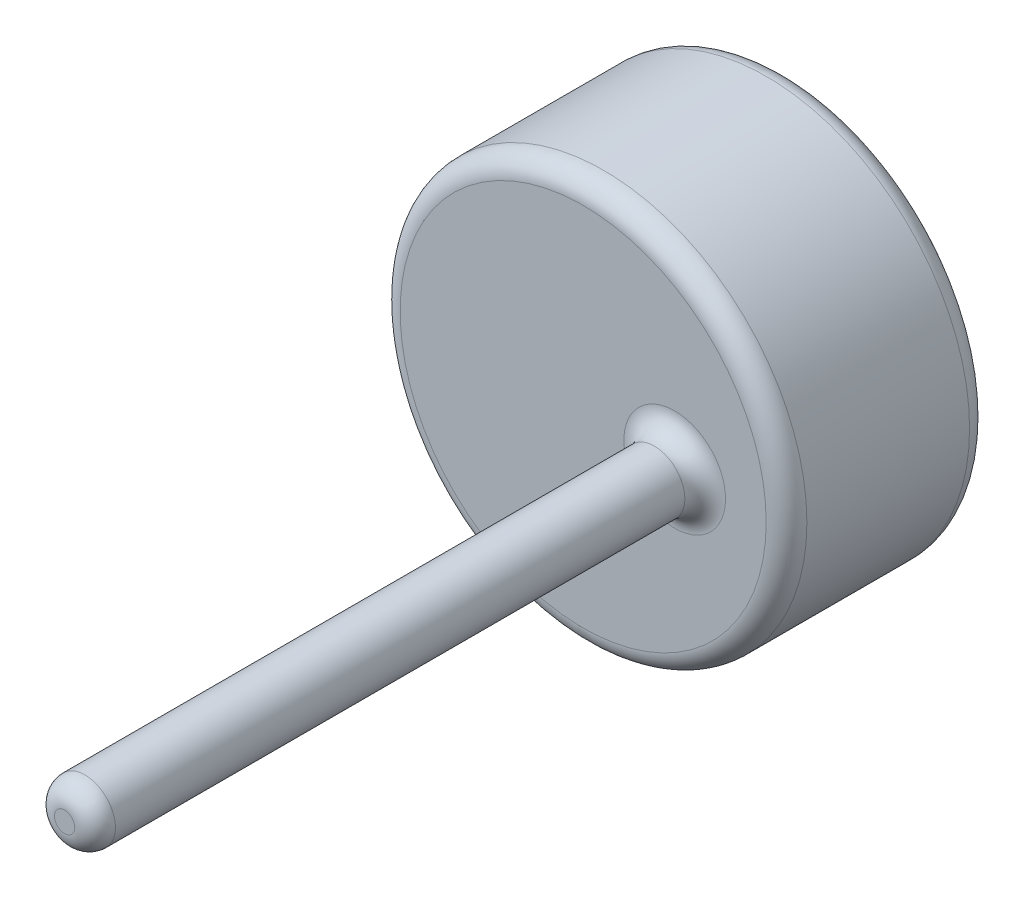
ISO-10303-21;
HEADER;
FILE_DESCRIPTION(('STEP AP214'),'2;1');
FILE_NAME('part.step','',(''),(''),'','','');
FILE_SCHEMA(('AUTOMOTIVE_DESIGN { 1 0 10303 214 1 1 1 1 }'));
ENDSEC;
DATA;
#1=APPLICATION_CONTEXT('core data for automotive mechanical design processes');
#2=APPLICATION_PROTOCOL_DEFINITION('international standard','automotive_design',2000,#1);
#3=PRODUCT_CONTEXT('',#1,'mechanical');
#4=PRODUCT('Part','Part','',(#3));
#5=PRODUCT_RELATED_PRODUCT_CATEGORY('part','',(#4));
#6=PRODUCT_DEFINITION_FORMATION('','',#4);
#7=PRODUCT_DEFINITION_CONTEXT('part definition',#1,'design');
#8=PRODUCT_DEFINITION('design','',#6,#7);
#9=PRODUCT_DEFINITION_SHAPE('','',#8);
#10=(LENGTH_UNIT() NAMED_UNIT(*) SI_UNIT(.MILLI.,.METRE.));
#11=(NAMED_UNIT(*) PLANE_ANGLE_UNIT() SI_UNIT($,.RADIAN.));
#12=(NAMED_UNIT(*) SI_UNIT($,.STERADIAN.) SOLID_ANGLE_UNIT());
#13=UNCERTAINTY_MEASURE_WITH_UNIT(LENGTH_MEASURE(1.E-05),#10,'distance_accuracy_value','');
#14=(GEOMETRIC_REPRESENTATION_CONTEXT(3) GLOBAL_UNCERTAINTY_ASSIGNED_CONTEXT((#13)) GLOBAL_UNIT_ASSIGNED_CONTEXT((#10,
#11,#12)) REPRESENTATION_CONTEXT('',''));
#15=CARTESIAN_POINT('',(0.,0.,0.));
#16=DIRECTION('',(0.,0.,1.));
#17=DIRECTION('',(1.,0.,0.));
#18=AXIS2_PLACEMENT_3D('',#15,#16,#17);
#19=CARTESIAN_POINT('',(0.,0.,10.));
#20=DIRECTION('',(0.,0.,-1.));
#21=DIRECTION('',(-1.,0.,0.));
#22=AXIS2_PLACEMENT_3D('',#19,#20,#21);
#23=CYLINDRICAL_SURFACE('',#22,10.);
#24=CARTESIAN_POINT('',(0.,0.,9.));
#25=DIRECTION('',(0.,0.,1.));
#26=DIRECTION('',(1.,0.,0.));
#27=AXIS2_PLACEMENT_3D('',#24,#25,#26);
#28=CIRCLE('',#27,10.);
#29=CARTESIAN_POINT('',(10.,0.,9.));
#30=VERTEX_POINT('',#29);
#31=EDGE_CURVE('E38',#30,#30,#28,.F.);
#32=ORIENTED_EDGE('',*,*,#31,.T.);
#33=EDGE_LOOP('',(#32));
#34=FACE_BOUND('',#33,.T.);
#35=CARTESIAN_POINT('',(0.,0.,0.999999999999999));
#36=DIRECTION('',(0.,0.,1.));
#37=DIRECTION('',(1.,0.,0.));
#38=AXIS2_PLACEMENT_3D('',#35,#36,#37);
#39=CIRCLE('',#38,10.);
#40=CARTESIAN_POINT('',(10.,0.,0.999999999999999));
#41=VERTEX_POINT('',#40);
#42=EDGE_CURVE('E42',#41,#41,#39,.T.);
#43=ORIENTED_EDGE('',*,*,#42,.T.);
#44=EDGE_LOOP('',(#43));
#45=FACE_BOUND('',#44,.T.);
#46=ADVANCED_FACE('F31',(#34,#45),#23,.T.);
#47=CARTESIAN_POINT('',(0.,0.,10.));
#48=DIRECTION('',(0.,0.,1.));
#49=DIRECTION('',(1.,0.,0.));
#50=AXIS2_PLACEMENT_3D('',#47,#48,#49);
#51=PLANE('',#50);
#52=CARTESIAN_POINT('',(0.,0.,10.));
#53=DIRECTION('',(0.,0.,1.));
#54=DIRECTION('',(1.,0.,0.));
#55=AXIS2_PLACEMENT_3D('',#52,#53,#54);
#56=CIRCLE('',#55,9.);
#57=CARTESIAN_POINT('',(9.,0.,10.));
#58=VERTEX_POINT('',#57);
#59=EDGE_CURVE('E46',#58,#58,#56,.T.);
#60=ORIENTED_EDGE('',*,*,#59,.T.);
#61=EDGE_LOOP('',(#60));
#62=FACE_BOUND('',#61,.T.);
#63=CARTESIAN_POINT('',(4.5,0.,10.));
#64=DIRECTION('',(0.,0.,1.));
#65=DIRECTION('',(1.,0.,0.));
#66=AXIS2_PLACEMENT_3D('',#63,#64,#65);
#67=CIRCLE('',#66,2.5);
#68=CARTESIAN_POINT('',(7.,0.,10.));
#69=VERTEX_POINT('',#68);
#70=EDGE_CURVE('E51',#69,#69,#67,.F.);
#71=ORIENTED_EDGE('',*,*,#70,.T.);
#72=EDGE_LOOP('',(#71));
#73=FACE_BOUND('',#72,.T.);
#74=ADVANCED_FACE('F83',(#62,#73),#51,.T.);
#75=CARTESIAN_POINT('',(0.,0.,0.));
#76=DIRECTION('',(0.,0.,1.));
#77=DIRECTION('',(1.,0.,0.));
#78=AXIS2_PLACEMENT_3D('',#75,#76,#77);
#79=PLANE('',#78);
#80=CARTESIAN_POINT('',(0.,0.,0.));
#81=DIRECTION('',(0.,0.,1.));
#82=DIRECTION('',(1.,0.,0.));
#83=AXIS2_PLACEMENT_3D('',#80,#81,#82);
#84=CIRCLE('',#83,9.);
#85=CARTESIAN_POINT('',(9.,0.,0.));
#86=VERTEX_POINT('',#85);
#87=EDGE_CURVE('E10',#86,#86,#84,.F.);
#88=ORIENTED_EDGE('',*,*,#87,.T.);
#89=EDGE_LOOP('',(#88));
#90=FACE_BOUND('',#89,.T.);
#91=ADVANCED_FACE('F87',(#90),#79,.F.);
#92=CARTESIAN_POINT('',(4.5,0.,40.));
#93=DIRECTION('',(0.,0.,-1.));
#94=DIRECTION('',(-1.,0.,0.));
#95=AXIS2_PLACEMENT_3D('',#92,#93,#94);
#96=CYLINDRICAL_SURFACE('',#95,1.5);
#97=CARTESIAN_POINT('',(4.5,0.,39.));
#98=DIRECTION('',(0.,0.,1.));
#99=DIRECTION('',(1.,0.,0.));
#100=AXIS2_PLACEMENT_3D('',#97,#98,#99);
#101=CIRCLE('',#100,1.5);
#102=CARTESIAN_POINT('',(6.,0.,39.));
#103=VERTEX_POINT('',#102);
#104=EDGE_CURVE('E54',#103,#103,#101,.F.);
#105=ORIENTED_EDGE('',*,*,#104,.T.);
#106=EDGE_LOOP('',(#105));
#107=FACE_BOUND('',#106,.T.);
#108=CARTESIAN_POINT('',(4.5,0.,11.));
#109=DIRECTION('',(0.,0.,1.));
#110=DIRECTION('',(1.,0.,0.));
#111=AXIS2_PLACEMENT_3D('',#108,#109,#110);
#112=CIRCLE('',#111,1.5);
#113=CARTESIAN_POINT('',(6.,0.,11.));
#114=VERTEX_POINT('',#113);
#115=EDGE_CURVE('E57',#114,#114,#112,.T.);
#116=ORIENTED_EDGE('',*,*,#115,.T.);
#117=EDGE_LOOP('',(#116));
#118=FACE_BOUND('',#117,.T.);
#119=ADVANCED_FACE('F78',(#107,#118),#96,.T.);
#120=CARTESIAN_POINT('',(4.5,0.,40.));
#121=DIRECTION('',(0.,0.,1.));
#122=DIRECTION('',(1.,0.,0.));
#123=AXIS2_PLACEMENT_3D('',#120,#121,#122);
#124=PLANE('',#123);
#125=CARTESIAN_POINT('',(4.5,0.,40.));
#126=DIRECTION('',(0.,0.,1.));
#127=DIRECTION('',(1.,0.,0.));
#128=AXIS2_PLACEMENT_3D('',#125,#126,#127);
#129=CIRCLE('',#128,0.5);
#130=CARTESIAN_POINT('',(5.,0.,40.));
#131=VERTEX_POINT('',#130);
#132=EDGE_CURVE('E60',#131,#131,#129,.T.);
#133=ORIENTED_EDGE('',*,*,#132,.T.);
#134=EDGE_LOOP('',(#133));
#135=FACE_BOUND('',#134,.T.);
#136=ADVANCED_FACE('F64',(#135),#124,.T.);
#137=CARTESIAN_POINT('',(4.5,0.,39.));
#138=DIRECTION('',(0.,0.,1.));
#139=DIRECTION('',(1.,0.,0.));
#140=AXIS2_PLACEMENT_3D('',#137,#138,#139);
#141=DEGENERATE_TOROIDAL_SURFACE('',#140,0.5,1.,.T.);
#142=ORIENTED_EDGE('',*,*,#104,.F.);
#143=EDGE_LOOP('',(#142));
#144=FACE_BOUND('',#143,.T.);
#145=ORIENTED_EDGE('',*,*,#132,.F.);
#146=EDGE_LOOP('',(#145));
#147=FACE_BOUND('',#146,.T.);
#148=ADVANCED_FACE('F66',(#144,#147),#141,.T.);
#149=CARTESIAN_POINT('',(0.,0.,9.));
#150=DIRECTION('',(0.,0.,1.));
#151=DIRECTION('',(1.,0.,0.));
#152=AXIS2_PLACEMENT_3D('',#149,#150,#151);
#153=TOROIDAL_SURFACE('',#152,9.,1.);
#154=ORIENTED_EDGE('',*,*,#31,.F.);
#155=EDGE_LOOP('',(#154));
#156=FACE_BOUND('',#155,.T.);
#157=ORIENTED_EDGE('',*,*,#59,.F.);
#158=EDGE_LOOP('',(#157));
#159=FACE_BOUND('',#158,.T.);
#160=ADVANCED_FACE('F68',(#156,#159),#153,.T.);
#161=CARTESIAN_POINT('',(4.5,0.,11.));
#162=DIRECTION('',(0.,0.,1.));
#163=DIRECTION('',(1.,0.,0.));
#164=AXIS2_PLACEMENT_3D('',#161,#162,#163);
#165=TOROIDAL_SURFACE('',#164,2.5,1.);
#166=ORIENTED_EDGE('',*,*,#70,.F.);
#167=EDGE_LOOP('',(#166));
#168=FACE_BOUND('',#167,.T.);
#169=ORIENTED_EDGE('',*,*,#115,.F.);
#170=EDGE_LOOP('',(#169));
#171=FACE_BOUND('',#170,.T.);
#172=ADVANCED_FACE('F75',(#168,#171),#165,.F.);
#173=CARTESIAN_POINT('',(0.,0.,0.999999999999999));
#174=DIRECTION('',(0.,0.,1.));
#175=DIRECTION('',(1.,0.,0.));
#176=AXIS2_PLACEMENT_3D('',#173,#174,#175);
#177=TOROIDAL_SURFACE('',#176,9.,1.);
#178=ORIENTED_EDGE('',*,*,#87,.F.);
#179=EDGE_LOOP('',(#178));
#180=FACE_BOUND('',#179,.T.);
#181=ORIENTED_EDGE('',*,*,#42,.F.);
#182=EDGE_LOOP('',(#181));
#183=FACE_BOUND('',#182,.T.);
#184=ADVANCED_FACE('F33',(#180,#183),#177,.T.);
#185=CLOSED_SHELL('',(#46,#74,#91,#119,#136,#148,#160,#172,#184));
#186=MANIFOLD_SOLID_BREP('B2',#185);
#187=ADVANCED_BREP_SHAPE_REPRESENTATION('',(#18,#186),#14);
#188=SHAPE_DEFINITION_REPRESENTATION(#9,#187);
ENDSEC;
END-ISO-10303-21;
